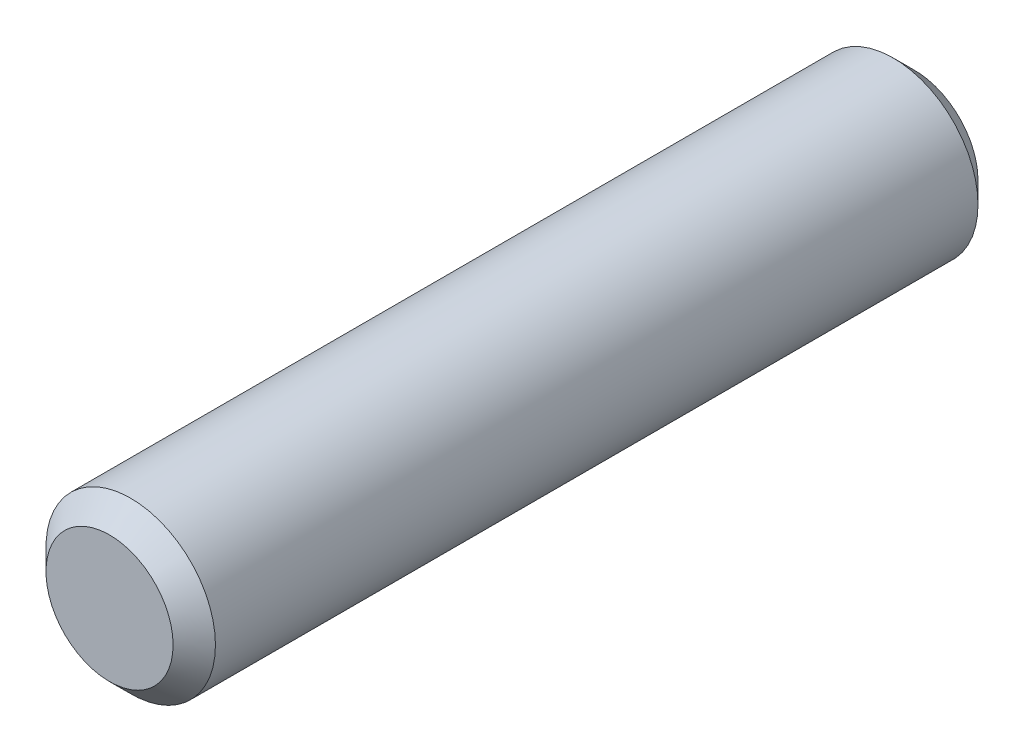
ISO-10303-21;
HEADER;
FILE_DESCRIPTION(('STEP AP214'),'2;1');
FILE_NAME('part.step','',(''),(''),'','','');
FILE_SCHEMA(('AUTOMOTIVE_DESIGN { 1 0 10303 214 1 1 1 1 }'));
ENDSEC;
DATA;
#1=APPLICATION_CONTEXT('core data for automotive mechanical design processes');
#2=APPLICATION_PROTOCOL_DEFINITION('international standard','automotive_design',2000,#1);
#3=PRODUCT_CONTEXT('',#1,'mechanical');
#4=PRODUCT('Part','Part','',(#3));
#5=PRODUCT_RELATED_PRODUCT_CATEGORY('part','',(#4));
#6=PRODUCT_DEFINITION_FORMATION('','',#4);
#7=PRODUCT_DEFINITION_CONTEXT('part definition',#1,'design');
#8=PRODUCT_DEFINITION('design','',#6,#7);
#9=PRODUCT_DEFINITION_SHAPE('','',#8);
#10=(LENGTH_UNIT() NAMED_UNIT(*) SI_UNIT(.MILLI.,.METRE.));
#11=(NAMED_UNIT(*) PLANE_ANGLE_UNIT() SI_UNIT($,.RADIAN.));
#12=(NAMED_UNIT(*) SI_UNIT($,.STERADIAN.) SOLID_ANGLE_UNIT());
#13=UNCERTAINTY_MEASURE_WITH_UNIT(LENGTH_MEASURE(1.E-05),#10,'distance_accuracy_value','');
#14=(GEOMETRIC_REPRESENTATION_CONTEXT(3) GLOBAL_UNCERTAINTY_ASSIGNED_CONTEXT((#13)) GLOBAL_UNIT_ASSIGNED_CONTEXT((#10,
#11,#12)) REPRESENTATION_CONTEXT('',''));
#15=CARTESIAN_POINT('',(0.,0.,0.));
#16=DIRECTION('',(0.,0.,1.));
#17=DIRECTION('',(1.,0.,0.));
#18=AXIS2_PLACEMENT_3D('',#15,#16,#17);
#19=CARTESIAN_POINT('',(0.,0.,19.));
#20=DIRECTION('',(0.,0.,-1.));
#21=DIRECTION('',(-1.,0.,0.));
#22=AXIS2_PLACEMENT_3D('',#19,#20,#21);
#23=CYLINDRICAL_SURFACE('',#22,2.);
#24=CARTESIAN_POINT('',(0.,0.,0.500000000000007));
#25=DIRECTION('',(0.,0.,1.));
#26=DIRECTION('',(1.,0.,0.));
#27=AXIS2_PLACEMENT_3D('',#24,#25,#26);
#28=CIRCLE('',#27,2.);
#29=CARTESIAN_POINT('',(2.,0.,0.500000000000007));
#30=VERTEX_POINT('',#29);
#31=EDGE_CURVE('E56',#30,#30,#28,.T.);
#32=ORIENTED_EDGE('',*,*,#31,.T.);
#33=EDGE_LOOP('',(#32));
#34=FACE_BOUND('',#33,.T.);
#35=CARTESIAN_POINT('',(0.,0.,18.5));
#36=DIRECTION('',(0.,0.,1.));
#37=DIRECTION('',(1.,0.,0.));
#38=AXIS2_PLACEMENT_3D('',#35,#36,#37);
#39=CIRCLE('',#38,2.);
#40=CARTESIAN_POINT('',(2.,0.,18.5));
#41=VERTEX_POINT('',#40);
#42=EDGE_CURVE('E62',#41,#41,#39,.F.);
#43=ORIENTED_EDGE('',*,*,#42,.T.);
#44=EDGE_LOOP('',(#43));
#45=FACE_BOUND('',#44,.T.);
#46=ADVANCED_FACE('F41',(#34,#45),#23,.T.);
#47=CARTESIAN_POINT('',(0.,0.,19.));
#48=DIRECTION('',(0.,0.,1.));
#49=DIRECTION('',(1.,0.,0.));
#50=AXIS2_PLACEMENT_3D('',#47,#48,#49);
#51=PLANE('',#50);
#52=CARTESIAN_POINT('',(0.,0.,19.));
#53=DIRECTION('',(0.,0.,1.));
#54=DIRECTION('',(1.,0.,0.));
#55=AXIS2_PLACEMENT_3D('',#52,#53,#54);
#56=CIRCLE('',#55,1.5);
#57=CARTESIAN_POINT('',(1.5,0.,19.));
#58=VERTEX_POINT('',#57);
#59=EDGE_CURVE('E10',#58,#58,#56,.T.);
#60=ORIENTED_EDGE('',*,*,#59,.T.);
#61=EDGE_LOOP('',(#60));
#62=FACE_BOUND('',#61,.T.);
#63=ADVANCED_FACE('F80',(#62),#51,.T.);
#64=CARTESIAN_POINT('',(0.,0.,0.));
#65=DIRECTION('',(0.,0.,1.));
#66=DIRECTION('',(1.,0.,0.));
#67=AXIS2_PLACEMENT_3D('',#64,#65,#66);
#68=PLANE('',#67);
#69=CARTESIAN_POINT('',(0.,0.,0.));
#70=DIRECTION('',(0.,0.,1.));
#71=DIRECTION('',(1.,0.,0.));
#72=AXIS2_PLACEMENT_3D('',#69,#70,#71);
#73=CIRCLE('',#72,1.49999999999999);
#74=CARTESIAN_POINT('',(1.49999999999999,0.,0.));
#75=VERTEX_POINT('',#74);
#76=EDGE_CURVE('E50',#75,#75,#73,.F.);
#77=ORIENTED_EDGE('',*,*,#76,.T.);
#78=EDGE_LOOP('',(#77));
#79=FACE_BOUND('',#78,.T.);
#80=ADVANCED_FACE('F77',(#79),#68,.F.);
#81=CARTESIAN_POINT('',(0.,0.,0.500000000000007));
#82=DIRECTION('',(0.,0.,1.));
#83=DIRECTION('',(1.,0.,0.));
#84=AXIS2_PLACEMENT_3D('',#81,#82,#83);
#85=CONICAL_SURFACE('',#84,2.,0.785398163397451);
#86=ORIENTED_EDGE('',*,*,#76,.F.);
#87=EDGE_LOOP('',(#86));
#88=FACE_BOUND('',#87,.T.);
#89=ORIENTED_EDGE('',*,*,#31,.F.);
#90=EDGE_LOOP('',(#89));
#91=FACE_BOUND('',#90,.T.);
#92=ADVANCED_FACE('F73',(#88,#91),#85,.T.);
#93=CARTESIAN_POINT('',(0.,0.,19.));
#94=DIRECTION('',(0.,0.,-1.));
#95=DIRECTION('',(-1.,0.,0.));
#96=AXIS2_PLACEMENT_3D('',#93,#94,#95);
#97=CONICAL_SURFACE('',#96,1.5,0.785398163397448);
#98=ORIENTED_EDGE('',*,*,#42,.F.);
#99=EDGE_LOOP('',(#98));
#100=FACE_BOUND('',#99,.T.);
#101=ORIENTED_EDGE('',*,*,#59,.F.);
#102=EDGE_LOOP('',(#101));
#103=FACE_BOUND('',#102,.T.);
#104=ADVANCED_FACE('F44',(#100,#103),#97,.T.);
#105=CLOSED_SHELL('',(#46,#63,#80,#92,#104));
#106=MANIFOLD_SOLID_BREP('B2',#105);
#107=ADVANCED_BREP_SHAPE_REPRESENTATION('',(#18,#106),#14);
#108=SHAPE_DEFINITION_REPRESENTATION(#9,#107);
ENDSEC;
END-ISO-10303-21;
